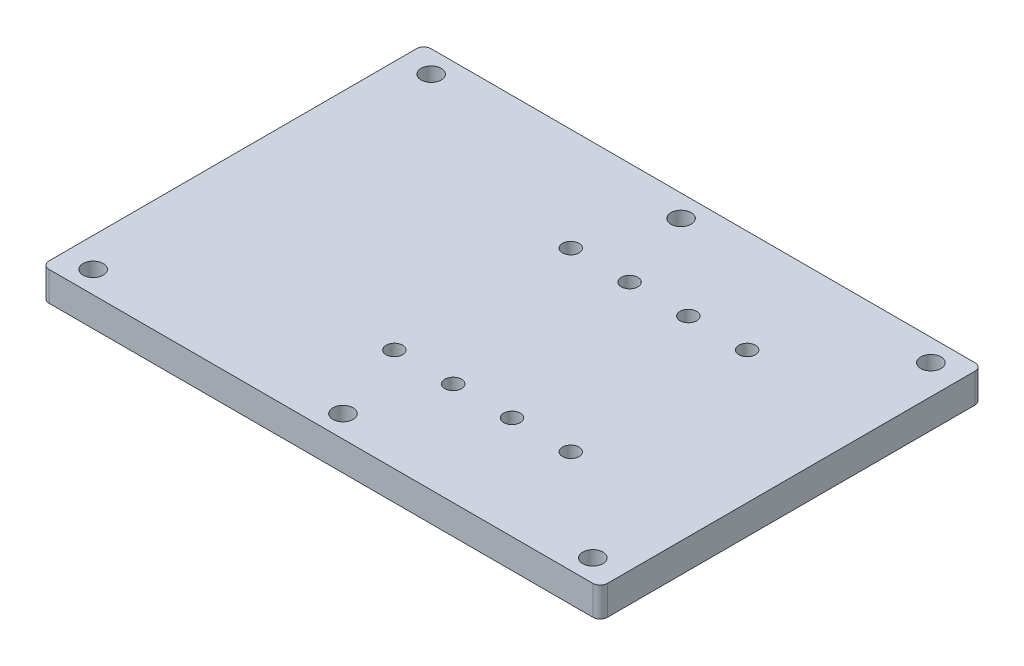
ISO-10303-21;
HEADER;
FILE_DESCRIPTION(('STEP AP214'),'2;1');
FILE_NAME('part.step','',(''),(''),'','','');
FILE_SCHEMA(('AUTOMOTIVE_DESIGN { 1 0 10303 214 1 1 1 1 }'));
ENDSEC;
DATA;
#1=APPLICATION_CONTEXT('core data for automotive mechanical design processes');
#2=APPLICATION_PROTOCOL_DEFINITION('international standard','automotive_design',2000,#1);
#3=PRODUCT_CONTEXT('',#1,'mechanical');
#4=PRODUCT('Part','Part','',(#3));
#5=PRODUCT_RELATED_PRODUCT_CATEGORY('part','',(#4));
#6=PRODUCT_DEFINITION_FORMATION('','',#4);
#7=PRODUCT_DEFINITION_CONTEXT('part definition',#1,'design');
#8=PRODUCT_DEFINITION('design','',#6,#7);
#9=PRODUCT_DEFINITION_SHAPE('','',#8);
#10=(LENGTH_UNIT() NAMED_UNIT(*) SI_UNIT(.MILLI.,.METRE.));
#11=(NAMED_UNIT(*) PLANE_ANGLE_UNIT() SI_UNIT($,.RADIAN.));
#12=(NAMED_UNIT(*) SI_UNIT($,.STERADIAN.) SOLID_ANGLE_UNIT());
#13=UNCERTAINTY_MEASURE_WITH_UNIT(LENGTH_MEASURE(1.E-05),#10,'distance_accuracy_value','');
#14=(GEOMETRIC_REPRESENTATION_CONTEXT(3) GLOBAL_UNCERTAINTY_ASSIGNED_CONTEXT((#13)) GLOBAL_UNIT_ASSIGNED_CONTEXT((#10,
#11,#12)) REPRESENTATION_CONTEXT('',''));
#15=CARTESIAN_POINT('',(0.,0.,0.));
#16=DIRECTION('',(0.,0.,1.));
#17=DIRECTION('',(1.,0.,0.));
#18=AXIS2_PLACEMENT_3D('',#15,#16,#17);
#19=CARTESIAN_POINT('',(241.3,25.4,-165.1));
#20=DIRECTION('',(-1.,0.,0.));
#21=DIRECTION('',(0.,0.,1.));
#22=AXIS2_PLACEMENT_3D('',#19,#20,#21);
#23=PLANE('',#22);
#24=DIRECTION('',(0.,0.,-1.));
#25=VECTOR('',#24,1.);
#26=CARTESIAN_POINT('',(241.3,25.4,-165.1));
#27=LINE('',#26,#25);
#28=CARTESIAN_POINT('',(241.3,25.4,158.75));
#29=VERTEX_POINT('',#28);
#30=CARTESIAN_POINT('',(241.3,25.4,-158.75));
#31=VERTEX_POINT('',#30);
#32=EDGE_CURVE('E130',#29,#31,#27,.T.);
#33=ORIENTED_EDGE('',*,*,#32,.F.);
#34=DIRECTION('',(0.,-1.,0.));
#35=VECTOR('',#34,1.);
#36=CARTESIAN_POINT('',(241.3,25.4,158.75));
#37=LINE('',#36,#35);
#38=CARTESIAN_POINT('',(241.3,0.,158.75));
#39=VERTEX_POINT('',#38);
#40=EDGE_CURVE('E156',#29,#39,#37,.T.);
#41=ORIENTED_EDGE('',*,*,#40,.T.);
#42=DIRECTION('',(0.,0.,-1.));
#43=VECTOR('',#42,1.);
#44=CARTESIAN_POINT('',(241.3,0.,-165.1));
#45=LINE('',#44,#43);
#46=CARTESIAN_POINT('',(241.3,0.,-158.75));
#47=VERTEX_POINT('',#46);
#48=EDGE_CURVE('E162',#39,#47,#45,.T.);
#49=ORIENTED_EDGE('',*,*,#48,.T.);
#50=DIRECTION('',(0.,-1.,0.));
#51=VECTOR('',#50,1.);
#52=CARTESIAN_POINT('',(241.3,25.4,-158.75));
#53=LINE('',#52,#51);
#54=EDGE_CURVE('E154',#47,#31,#53,.F.);
#55=ORIENTED_EDGE('',*,*,#54,.T.);
#56=EDGE_LOOP('',(#33,#41,#49,#55));
#57=FACE_BOUND('',#56,.T.);
#58=ADVANCED_FACE('F38',(#57),#23,.F.);
#59=CARTESIAN_POINT('',(-241.3,25.4,-165.1));
#60=DIRECTION('',(0.,0.,1.));
#61=DIRECTION('',(1.,0.,0.));
#62=AXIS2_PLACEMENT_3D('',#59,#60,#61);
#63=PLANE('',#62);
#64=DIRECTION('',(-1.,0.,0.));
#65=VECTOR('',#64,1.);
#66=CARTESIAN_POINT('',(-241.3,25.4,-165.1));
#67=LINE('',#66,#65);
#68=CARTESIAN_POINT('',(234.95,25.4,-165.1));
#69=VERTEX_POINT('',#68);
#70=CARTESIAN_POINT('',(-234.95,25.4,-165.1));
#71=VERTEX_POINT('',#70);
#72=EDGE_CURVE('E133',#69,#71,#67,.T.);
#73=ORIENTED_EDGE('',*,*,#72,.F.);
#74=DIRECTION('',(0.,-1.,0.));
#75=VECTOR('',#74,1.);
#76=CARTESIAN_POINT('',(234.95,25.4,-165.1));
#77=LINE('',#76,#75);
#78=CARTESIAN_POINT('',(234.95,0.,-165.1));
#79=VERTEX_POINT('',#78);
#80=EDGE_CURVE('E11',#69,#79,#77,.T.);
#81=ORIENTED_EDGE('',*,*,#80,.T.);
#82=DIRECTION('',(-1.,0.,0.));
#83=VECTOR('',#82,1.);
#84=CARTESIAN_POINT('',(-241.3,0.,-165.1));
#85=LINE('',#84,#83);
#86=CARTESIAN_POINT('',(-234.95,0.,-165.1));
#87=VERTEX_POINT('',#86);
#88=EDGE_CURVE('E135',#79,#87,#85,.T.);
#89=ORIENTED_EDGE('',*,*,#88,.T.);
#90=DIRECTION('',(0.,-1.,0.));
#91=VECTOR('',#90,1.);
#92=CARTESIAN_POINT('',(-234.95,25.4,-165.1));
#93=LINE('',#92,#91);
#94=EDGE_CURVE('E46',#87,#71,#93,.F.);
#95=ORIENTED_EDGE('',*,*,#94,.T.);
#96=EDGE_LOOP('',(#73,#81,#89,#95));
#97=FACE_BOUND('',#96,.T.);
#98=ADVANCED_FACE('F278',(#97),#63,.F.);
#99=CARTESIAN_POINT('',(-241.3,25.4,-165.1));
#100=DIRECTION('',(1.,0.,0.));
#101=DIRECTION('',(0.,0.,-1.));
#102=AXIS2_PLACEMENT_3D('',#99,#100,#101);
#103=PLANE('',#102);
#104=DIRECTION('',(0.,0.,1.));
#105=VECTOR('',#104,1.);
#106=CARTESIAN_POINT('',(-241.3,0.,-165.1));
#107=LINE('',#106,#105);
#108=CARTESIAN_POINT('',(-241.3,0.,-158.75));
#109=VERTEX_POINT('',#108);
#110=CARTESIAN_POINT('',(-241.3,0.,158.75));
#111=VERTEX_POINT('',#110);
#112=EDGE_CURVE('E131',#109,#111,#107,.T.);
#113=ORIENTED_EDGE('',*,*,#112,.T.);
#114=DIRECTION('',(0.,-1.,0.));
#115=VECTOR('',#114,1.);
#116=CARTESIAN_POINT('',(-241.3,25.4,158.75));
#117=LINE('',#116,#115);
#118=CARTESIAN_POINT('',(-241.3,25.4,158.75));
#119=VERTEX_POINT('',#118);
#120=EDGE_CURVE('E109',#111,#119,#117,.F.);
#121=ORIENTED_EDGE('',*,*,#120,.T.);
#122=DIRECTION('',(0.,0.,1.));
#123=VECTOR('',#122,1.);
#124=CARTESIAN_POINT('',(-241.3,25.4,-165.1));
#125=LINE('',#124,#123);
#126=CARTESIAN_POINT('',(-241.3,25.4,-158.75));
#127=VERTEX_POINT('',#126);
#128=EDGE_CURVE('E174',#127,#119,#125,.T.);
#129=ORIENTED_EDGE('',*,*,#128,.F.);
#130=DIRECTION('',(0.,-1.,0.));
#131=VECTOR('',#130,1.);
#132=CARTESIAN_POINT('',(-241.3,25.4,-158.75));
#133=LINE('',#132,#131);
#134=EDGE_CURVE('E114',#127,#109,#133,.T.);
#135=ORIENTED_EDGE('',*,*,#134,.T.);
#136=EDGE_LOOP('',(#113,#121,#129,#135));
#137=FACE_BOUND('',#136,.T.);
#138=ADVANCED_FACE('F284',(#137),#103,.F.);
#139=CARTESIAN_POINT('',(-241.3,25.4,165.1));
#140=DIRECTION('',(0.,0.,-1.));
#141=DIRECTION('',(-1.,0.,0.));
#142=AXIS2_PLACEMENT_3D('',#139,#140,#141);
#143=PLANE('',#142);
#144=DIRECTION('',(1.,0.,0.));
#145=VECTOR('',#144,1.);
#146=CARTESIAN_POINT('',(-241.3,25.4,165.1));
#147=LINE('',#146,#145);
#148=CARTESIAN_POINT('',(-234.95,25.4,165.1));
#149=VERTEX_POINT('',#148);
#150=CARTESIAN_POINT('',(234.95,25.4,165.1));
#151=VERTEX_POINT('',#150);
#152=EDGE_CURVE('E124',#149,#151,#147,.T.);
#153=ORIENTED_EDGE('',*,*,#152,.F.);
#154=DIRECTION('',(0.,-1.,0.));
#155=VECTOR('',#154,1.);
#156=CARTESIAN_POINT('',(-234.95,25.4,165.1));
#157=LINE('',#156,#155);
#158=CARTESIAN_POINT('',(-234.95,0.,165.1));
#159=VERTEX_POINT('',#158);
#160=EDGE_CURVE('E108',#149,#159,#157,.T.);
#161=ORIENTED_EDGE('',*,*,#160,.T.);
#162=DIRECTION('',(1.,0.,0.));
#163=VECTOR('',#162,1.);
#164=CARTESIAN_POINT('',(-241.3,0.,165.1));
#165=LINE('',#164,#163);
#166=CARTESIAN_POINT('',(234.95,0.,165.1));
#167=VERTEX_POINT('',#166);
#168=EDGE_CURVE('E121',#159,#167,#165,.T.);
#169=ORIENTED_EDGE('',*,*,#168,.T.);
#170=DIRECTION('',(0.,-1.,0.));
#171=VECTOR('',#170,1.);
#172=CARTESIAN_POINT('',(234.95,25.4,165.1));
#173=LINE('',#172,#171);
#174=EDGE_CURVE('E126',#167,#151,#173,.F.);
#175=ORIENTED_EDGE('',*,*,#174,.T.);
#176=EDGE_LOOP('',(#153,#161,#169,#175));
#177=FACE_BOUND('',#176,.T.);
#178=ADVANCED_FACE('F120',(#177),#143,.F.);
#179=CARTESIAN_POINT('',(0.,25.4,0.));
#180=DIRECTION('',(0.,1.,0.));
#181=DIRECTION('',(0.,0.,1.));
#182=AXIS2_PLACEMENT_3D('',#179,#180,#181);
#183=PLANE('',#182);
#184=CARTESIAN_POINT('',(25.3999999999998,25.4,-76.2));
#185=DIRECTION('',(0.,1.,0.));
#186=DIRECTION('',(0.,0.,1.));
#187=AXIS2_PLACEMENT_3D('',#184,#185,#186);
#188=CIRCLE('',#187,7.1628);
#189=CARTESIAN_POINT('',(25.3999999999998,25.4,-69.0372));
#190=VERTEX_POINT('',#189);
#191=EDGE_CURVE('E210',#190,#190,#188,.T.);
#192=ORIENTED_EDGE('',*,*,#191,.F.);
#193=EDGE_LOOP('',(#192));
#194=FACE_BOUND('',#193,.T.);
#195=CARTESIAN_POINT('',(76.1999999999998,25.4,-76.2));
#196=DIRECTION('',(0.,1.,0.));
#197=DIRECTION('',(0.,0.,1.));
#198=AXIS2_PLACEMENT_3D('',#195,#196,#197);
#199=CIRCLE('',#198,7.1628);
#200=CARTESIAN_POINT('',(76.1999999999998,25.4,-69.0372));
#201=VERTEX_POINT('',#200);
#202=EDGE_CURVE('E213',#201,#201,#199,.T.);
#203=ORIENTED_EDGE('',*,*,#202,.F.);
#204=EDGE_LOOP('',(#203));
#205=FACE_BOUND('',#204,.T.);
#206=CARTESIAN_POINT('',(127.,25.4,-76.2));
#207=DIRECTION('',(0.,1.,0.));
#208=DIRECTION('',(0.,0.,1.));
#209=AXIS2_PLACEMENT_3D('',#206,#207,#208);
#210=CIRCLE('',#209,7.1628);
#211=CARTESIAN_POINT('',(127.,25.4,-69.0372));
#212=VERTEX_POINT('',#211);
#213=EDGE_CURVE('E216',#212,#212,#210,.T.);
#214=ORIENTED_EDGE('',*,*,#213,.F.);
#215=EDGE_LOOP('',(#214));
#216=FACE_BOUND('',#215,.T.);
#217=CARTESIAN_POINT('',(127.,25.4,76.2));
#218=DIRECTION('',(0.,1.,0.));
#219=DIRECTION('',(0.,0.,1.));
#220=AXIS2_PLACEMENT_3D('',#217,#218,#219);
#221=CIRCLE('',#220,7.1628);
#222=CARTESIAN_POINT('',(127.,25.4,83.3628));
#223=VERTEX_POINT('',#222);
#224=EDGE_CURVE('E219',#223,#223,#221,.T.);
#225=ORIENTED_EDGE('',*,*,#224,.F.);
#226=EDGE_LOOP('',(#225));
#227=FACE_BOUND('',#226,.T.);
#228=CARTESIAN_POINT('',(76.1999999999998,25.4,76.2));
#229=DIRECTION('',(0.,1.,0.));
#230=DIRECTION('',(0.,0.,1.));
#231=AXIS2_PLACEMENT_3D('',#228,#229,#230);
#232=CIRCLE('',#231,7.1628);
#233=CARTESIAN_POINT('',(76.1999999999998,25.4,83.3628));
#234=VERTEX_POINT('',#233);
#235=EDGE_CURVE('E222',#234,#234,#232,.T.);
#236=ORIENTED_EDGE('',*,*,#235,.F.);
#237=EDGE_LOOP('',(#236));
#238=FACE_BOUND('',#237,.T.);
#239=CARTESIAN_POINT('',(25.3999999999998,25.4,76.2));
#240=DIRECTION('',(0.,1.,0.));
#241=DIRECTION('',(0.,0.,1.));
#242=AXIS2_PLACEMENT_3D('',#239,#240,#241);
#243=CIRCLE('',#242,7.1628);
#244=CARTESIAN_POINT('',(25.3999999999998,25.4,83.3628));
#245=VERTEX_POINT('',#244);
#246=EDGE_CURVE('E225',#245,#245,#243,.T.);
#247=ORIENTED_EDGE('',*,*,#246,.F.);
#248=EDGE_LOOP('',(#247));
#249=FACE_BOUND('',#248,.T.);
#250=CARTESIAN_POINT('',(-25.4000000000002,25.4,76.2));
#251=DIRECTION('',(0.,1.,0.));
#252=DIRECTION('',(0.,0.,1.));
#253=AXIS2_PLACEMENT_3D('',#250,#251,#252);
#254=CIRCLE('',#253,7.1628);
#255=CARTESIAN_POINT('',(-25.4000000000002,25.4,83.3628));
#256=VERTEX_POINT('',#255);
#257=EDGE_CURVE('E228',#256,#256,#254,.T.);
#258=ORIENTED_EDGE('',*,*,#257,.F.);
#259=EDGE_LOOP('',(#258));
#260=FACE_BOUND('',#259,.T.);
#261=CARTESIAN_POINT('',(-25.4000000000002,25.4,-76.2));
#262=DIRECTION('',(0.,1.,0.));
#263=DIRECTION('',(0.,0.,1.));
#264=AXIS2_PLACEMENT_3D('',#261,#262,#263);
#265=CIRCLE('',#264,7.1628);
#266=CARTESIAN_POINT('',(-25.4000000000002,25.4,-69.0372));
#267=VERTEX_POINT('',#266);
#268=EDGE_CURVE('E231',#267,#267,#265,.T.);
#269=ORIENTED_EDGE('',*,*,#268,.F.);
#270=EDGE_LOOP('',(#269));
#271=FACE_BOUND('',#270,.T.);
#272=CARTESIAN_POINT('',(0.,25.4,-146.05));
#273=DIRECTION('',(0.,1.,0.));
#274=DIRECTION('',(0.,0.,1.));
#275=AXIS2_PLACEMENT_3D('',#272,#273,#274);
#276=CIRCLE('',#275,8.7376);
#277=CARTESIAN_POINT('',(0.,25.4,-137.3124));
#278=VERTEX_POINT('',#277);
#279=EDGE_CURVE('E167',#278,#278,#276,.T.);
#280=ORIENTED_EDGE('',*,*,#279,.F.);
#281=EDGE_LOOP('',(#280));
#282=FACE_BOUND('',#281,.T.);
#283=CARTESIAN_POINT('',(-215.9,25.4,146.05));
#284=DIRECTION('',(0.,1.,0.));
#285=DIRECTION('',(0.,0.,1.));
#286=AXIS2_PLACEMENT_3D('',#283,#284,#285);
#287=CIRCLE('',#286,8.73760000000002);
#288=CARTESIAN_POINT('',(-215.9,25.4,154.7876));
#289=VERTEX_POINT('',#288);
#290=EDGE_CURVE('E170',#289,#289,#287,.T.);
#291=ORIENTED_EDGE('',*,*,#290,.F.);
#292=EDGE_LOOP('',(#291));
#293=FACE_BOUND('',#292,.T.);
#294=CARTESIAN_POINT('',(215.9,25.4,146.05));
#295=DIRECTION('',(0.,1.,0.));
#296=DIRECTION('',(0.,0.,1.));
#297=AXIS2_PLACEMENT_3D('',#294,#295,#296);
#298=CIRCLE('',#297,8.73760000000002);
#299=CARTESIAN_POINT('',(215.9,25.4,154.7876));
#300=VERTEX_POINT('',#299);
#301=EDGE_CURVE('E180',#300,#300,#298,.T.);
#302=ORIENTED_EDGE('',*,*,#301,.F.);
#303=EDGE_LOOP('',(#302));
#304=FACE_BOUND('',#303,.T.);
#305=CARTESIAN_POINT('',(-215.9,25.4,-146.05));
#306=DIRECTION('',(0.,1.,0.));
#307=DIRECTION('',(0.,0.,1.));
#308=AXIS2_PLACEMENT_3D('',#305,#306,#307);
#309=CIRCLE('',#308,8.73760000000002);
#310=CARTESIAN_POINT('',(-215.9,25.4,-137.3124));
#311=VERTEX_POINT('',#310);
#312=EDGE_CURVE('E183',#311,#311,#309,.T.);
#313=ORIENTED_EDGE('',*,*,#312,.F.);
#314=EDGE_LOOP('',(#313));
#315=FACE_BOUND('',#314,.T.);
#316=CARTESIAN_POINT('',(0.,25.4,146.05));
#317=DIRECTION('',(0.,1.,0.));
#318=DIRECTION('',(0.,0.,1.));
#319=AXIS2_PLACEMENT_3D('',#316,#317,#318);
#320=CIRCLE('',#319,8.7376);
#321=CARTESIAN_POINT('',(0.,25.4,154.7876));
#322=VERTEX_POINT('',#321);
#323=EDGE_CURVE('E186',#322,#322,#320,.T.);
#324=ORIENTED_EDGE('',*,*,#323,.F.);
#325=EDGE_LOOP('',(#324));
#326=FACE_BOUND('',#325,.T.);
#327=CARTESIAN_POINT('',(215.9,25.4,-146.05));
#328=DIRECTION('',(0.,1.,0.));
#329=DIRECTION('',(0.,0.,1.));
#330=AXIS2_PLACEMENT_3D('',#327,#328,#329);
#331=CIRCLE('',#330,8.73760000000002);
#332=CARTESIAN_POINT('',(215.9,25.4,-137.3124));
#333=VERTEX_POINT('',#332);
#334=EDGE_CURVE('E189',#333,#333,#331,.T.);
#335=ORIENTED_EDGE('',*,*,#334,.F.);
#336=EDGE_LOOP('',(#335));
#337=FACE_BOUND('',#336,.T.);
#338=ORIENTED_EDGE('',*,*,#128,.T.);
#339=CARTESIAN_POINT('',(-234.95,25.4,158.75));
#340=DIRECTION('',(0.,1.,0.));
#341=DIRECTION('',(0.,0.,1.));
#342=AXIS2_PLACEMENT_3D('',#339,#340,#341);
#343=CIRCLE('',#342,6.35);
#344=EDGE_CURVE('E152',#119,#149,#343,.T.);
#345=ORIENTED_EDGE('',*,*,#344,.T.);
#346=ORIENTED_EDGE('',*,*,#152,.T.);
#347=CARTESIAN_POINT('',(234.95,25.4,158.75));
#348=DIRECTION('',(0.,1.,0.));
#349=DIRECTION('',(0.,0.,1.));
#350=AXIS2_PLACEMENT_3D('',#347,#348,#349);
#351=CIRCLE('',#350,6.35);
#352=EDGE_CURVE('E150',#151,#29,#351,.T.);
#353=ORIENTED_EDGE('',*,*,#352,.T.);
#354=ORIENTED_EDGE('',*,*,#32,.T.);
#355=CARTESIAN_POINT('',(234.95,25.4,-158.75));
#356=DIRECTION('',(0.,1.,0.));
#357=DIRECTION('',(0.,0.,1.));
#358=AXIS2_PLACEMENT_3D('',#355,#356,#357);
#359=CIRCLE('',#358,6.35);
#360=EDGE_CURVE('E59',#31,#69,#359,.T.);
#361=ORIENTED_EDGE('',*,*,#360,.T.);
#362=ORIENTED_EDGE('',*,*,#72,.T.);
#363=CARTESIAN_POINT('',(-234.95,25.4,-158.75));
#364=DIRECTION('',(0.,1.,0.));
#365=DIRECTION('',(0.,0.,1.));
#366=AXIS2_PLACEMENT_3D('',#363,#364,#365);
#367=CIRCLE('',#366,6.35);
#368=EDGE_CURVE('E147',#71,#127,#367,.T.);
#369=ORIENTED_EDGE('',*,*,#368,.T.);
#370=EDGE_LOOP('',(#338,#345,#346,#353,#354,#361,#362,#369));
#371=FACE_BOUND('',#370,.T.);
#372=ADVANCED_FACE('F305',(#194,#205,#216,#227,#238,#249,#260,#271,#282,#293,#304,#315,#326,
#337,#371),#183,.T.);
#373=CARTESIAN_POINT('',(0.,0.,0.));
#374=DIRECTION('',(0.,1.,0.));
#375=DIRECTION('',(0.,0.,1.));
#376=AXIS2_PLACEMENT_3D('',#373,#374,#375);
#377=PLANE('',#376);
#378=CARTESIAN_POINT('',(25.3999999999998,0.,-76.2));
#379=DIRECTION('',(0.,1.,0.));
#380=DIRECTION('',(0.,0.,1.));
#381=AXIS2_PLACEMENT_3D('',#378,#379,#380);
#382=CIRCLE('',#381,7.1628);
#383=CARTESIAN_POINT('',(25.3999999999998,0.,-69.0372));
#384=VERTEX_POINT('',#383);
#385=EDGE_CURVE('E237',#384,#384,#382,.T.);
#386=ORIENTED_EDGE('',*,*,#385,.T.);
#387=EDGE_LOOP('',(#386));
#388=FACE_BOUND('',#387,.T.);
#389=CARTESIAN_POINT('',(76.1999999999998,0.,-76.2));
#390=DIRECTION('',(0.,1.,0.));
#391=DIRECTION('',(0.,0.,1.));
#392=AXIS2_PLACEMENT_3D('',#389,#390,#391);
#393=CIRCLE('',#392,7.1628);
#394=CARTESIAN_POINT('',(76.1999999999998,0.,-69.0372));
#395=VERTEX_POINT('',#394);
#396=EDGE_CURVE('E245',#395,#395,#393,.T.);
#397=ORIENTED_EDGE('',*,*,#396,.T.);
#398=EDGE_LOOP('',(#397));
#399=FACE_BOUND('',#398,.T.);
#400=CARTESIAN_POINT('',(127.,0.,-76.2));
#401=DIRECTION('',(0.,1.,0.));
#402=DIRECTION('',(0.,0.,1.));
#403=AXIS2_PLACEMENT_3D('',#400,#401,#402);
#404=CIRCLE('',#403,7.1628);
#405=CARTESIAN_POINT('',(127.,0.,-69.0372));
#406=VERTEX_POINT('',#405);
#407=EDGE_CURVE('E241',#406,#406,#404,.T.);
#408=ORIENTED_EDGE('',*,*,#407,.T.);
#409=EDGE_LOOP('',(#408));
#410=FACE_BOUND('',#409,.T.);
#411=CARTESIAN_POINT('',(127.,0.,76.2));
#412=DIRECTION('',(0.,1.,0.));
#413=DIRECTION('',(0.,0.,-1.));
#414=AXIS2_PLACEMENT_3D('',#411,#412,#413);
#415=CIRCLE('',#414,7.1628);
#416=CARTESIAN_POINT('',(127.,0.,69.0372));
#417=VERTEX_POINT('',#416);
#418=EDGE_CURVE('E238',#417,#417,#415,.T.);
#419=ORIENTED_EDGE('',*,*,#418,.T.);
#420=EDGE_LOOP('',(#419));
#421=FACE_BOUND('',#420,.T.);
#422=CARTESIAN_POINT('',(76.1999999999998,0.,76.2));
#423=DIRECTION('',(0.,1.,0.));
#424=DIRECTION('',(0.,0.,-1.));
#425=AXIS2_PLACEMENT_3D('',#422,#423,#424);
#426=CIRCLE('',#425,7.1628);
#427=CARTESIAN_POINT('',(76.1999999999998,0.,69.0372));
#428=VERTEX_POINT('',#427);
#429=EDGE_CURVE('E242',#428,#428,#426,.T.);
#430=ORIENTED_EDGE('',*,*,#429,.T.);
#431=EDGE_LOOP('',(#430));
#432=FACE_BOUND('',#431,.T.);
#433=CARTESIAN_POINT('',(25.3999999999998,0.,76.2));
#434=DIRECTION('',(0.,1.,0.));
#435=DIRECTION('',(0.,0.,-1.));
#436=AXIS2_PLACEMENT_3D('',#433,#434,#435);
#437=CIRCLE('',#436,7.1628);
#438=CARTESIAN_POINT('',(25.3999999999998,0.,69.0372));
#439=VERTEX_POINT('',#438);
#440=EDGE_CURVE('E253',#439,#439,#437,.T.);
#441=ORIENTED_EDGE('',*,*,#440,.T.);
#442=EDGE_LOOP('',(#441));
#443=FACE_BOUND('',#442,.T.);
#444=CARTESIAN_POINT('',(-25.4000000000002,0.,76.2));
#445=DIRECTION('',(0.,1.,0.));
#446=DIRECTION('',(0.,0.,-1.));
#447=AXIS2_PLACEMENT_3D('',#444,#445,#446);
#448=CIRCLE('',#447,7.1628);
#449=CARTESIAN_POINT('',(-25.4000000000002,0.,69.0372));
#450=VERTEX_POINT('',#449);
#451=EDGE_CURVE('E250',#450,#450,#448,.T.);
#452=ORIENTED_EDGE('',*,*,#451,.T.);
#453=EDGE_LOOP('',(#452));
#454=FACE_BOUND('',#453,.T.);
#455=CARTESIAN_POINT('',(-25.4000000000002,0.,-76.2));
#456=DIRECTION('',(0.,1.,0.));
#457=DIRECTION('',(0.,0.,1.));
#458=AXIS2_PLACEMENT_3D('',#455,#456,#457);
#459=CIRCLE('',#458,7.1628);
#460=CARTESIAN_POINT('',(-25.4000000000002,0.,-69.0372));
#461=VERTEX_POINT('',#460);
#462=EDGE_CURVE('E234',#461,#461,#459,.T.);
#463=ORIENTED_EDGE('',*,*,#462,.T.);
#464=EDGE_LOOP('',(#463));
#465=FACE_BOUND('',#464,.T.);
#466=CARTESIAN_POINT('',(0.,0.,-146.05));
#467=DIRECTION('',(0.,1.,0.));
#468=DIRECTION('',(0.,0.,1.));
#469=AXIS2_PLACEMENT_3D('',#466,#467,#468);
#470=CIRCLE('',#469,8.7376);
#471=CARTESIAN_POINT('',(0.,0.,-137.3124));
#472=VERTEX_POINT('',#471);
#473=EDGE_CURVE('E202',#472,#472,#470,.T.);
#474=ORIENTED_EDGE('',*,*,#473,.T.);
#475=EDGE_LOOP('',(#474));
#476=FACE_BOUND('',#475,.T.);
#477=CARTESIAN_POINT('',(-215.9,0.,146.05));
#478=DIRECTION('',(0.,1.,0.));
#479=DIRECTION('',(0.,0.,1.));
#480=AXIS2_PLACEMENT_3D('',#477,#478,#479);
#481=CIRCLE('',#480,8.73760000000002);
#482=CARTESIAN_POINT('',(-215.9,0.,154.7876));
#483=VERTEX_POINT('',#482);
#484=EDGE_CURVE('E199',#483,#483,#481,.T.);
#485=ORIENTED_EDGE('',*,*,#484,.T.);
#486=EDGE_LOOP('',(#485));
#487=FACE_BOUND('',#486,.T.);
#488=CARTESIAN_POINT('',(215.9,0.,146.05));
#489=DIRECTION('',(0.,1.,0.));
#490=DIRECTION('',(0.,0.,1.));
#491=AXIS2_PLACEMENT_3D('',#488,#489,#490);
#492=CIRCLE('',#491,8.73760000000002);
#493=CARTESIAN_POINT('',(215.9,0.,154.7876));
#494=VERTEX_POINT('',#493);
#495=EDGE_CURVE('E196',#494,#494,#492,.T.);
#496=ORIENTED_EDGE('',*,*,#495,.T.);
#497=EDGE_LOOP('',(#496));
#498=FACE_BOUND('',#497,.T.);
#499=CARTESIAN_POINT('',(-215.9,0.,-146.05));
#500=DIRECTION('',(0.,1.,0.));
#501=DIRECTION('',(0.,0.,1.));
#502=AXIS2_PLACEMENT_3D('',#499,#500,#501);
#503=CIRCLE('',#502,8.73760000000002);
#504=CARTESIAN_POINT('',(-215.9,0.,-137.3124));
#505=VERTEX_POINT('',#504);
#506=EDGE_CURVE('E195',#505,#505,#503,.T.);
#507=ORIENTED_EDGE('',*,*,#506,.T.);
#508=EDGE_LOOP('',(#507));
#509=FACE_BOUND('',#508,.T.);
#510=CARTESIAN_POINT('',(0.,0.,146.05));
#511=DIRECTION('',(0.,1.,0.));
#512=DIRECTION('',(0.,0.,1.));
#513=AXIS2_PLACEMENT_3D('',#510,#511,#512);
#514=CIRCLE('',#513,8.7376);
#515=CARTESIAN_POINT('',(0.,0.,154.7876));
#516=VERTEX_POINT('',#515);
#517=EDGE_CURVE('E205',#516,#516,#514,.T.);
#518=ORIENTED_EDGE('',*,*,#517,.T.);
#519=EDGE_LOOP('',(#518));
#520=FACE_BOUND('',#519,.T.);
#521=CARTESIAN_POINT('',(215.9,0.,-146.05));
#522=DIRECTION('',(0.,1.,0.));
#523=DIRECTION('',(0.,0.,1.));
#524=AXIS2_PLACEMENT_3D('',#521,#522,#523);
#525=CIRCLE('',#524,8.73760000000002);
#526=CARTESIAN_POINT('',(215.9,0.,-137.3124));
#527=VERTEX_POINT('',#526);
#528=EDGE_CURVE('E192',#527,#527,#525,.T.);
#529=ORIENTED_EDGE('',*,*,#528,.T.);
#530=EDGE_LOOP('',(#529));
#531=FACE_BOUND('',#530,.T.);
#532=ORIENTED_EDGE('',*,*,#168,.F.);
#533=CARTESIAN_POINT('',(-234.95,0.,158.75));
#534=DIRECTION('',(0.,1.,0.));
#535=DIRECTION('',(0.,0.,1.));
#536=AXIS2_PLACEMENT_3D('',#533,#534,#535);
#537=CIRCLE('',#536,6.35);
#538=EDGE_CURVE('E104',#159,#111,#537,.F.);
#539=ORIENTED_EDGE('',*,*,#538,.T.);
#540=ORIENTED_EDGE('',*,*,#112,.F.);
#541=CARTESIAN_POINT('',(-234.95,0.,-158.75));
#542=DIRECTION('',(0.,1.,0.));
#543=DIRECTION('',(0.,0.,1.));
#544=AXIS2_PLACEMENT_3D('',#541,#542,#543);
#545=CIRCLE('',#544,6.35);
#546=EDGE_CURVE('E125',#109,#87,#545,.F.);
#547=ORIENTED_EDGE('',*,*,#546,.T.);
#548=ORIENTED_EDGE('',*,*,#88,.F.);
#549=CARTESIAN_POINT('',(234.95,0.,-158.75));
#550=DIRECTION('',(0.,1.,0.));
#551=DIRECTION('',(0.,0.,1.));
#552=AXIS2_PLACEMENT_3D('',#549,#550,#551);
#553=CIRCLE('',#552,6.35);
#554=EDGE_CURVE('E141',#79,#47,#553,.F.);
#555=ORIENTED_EDGE('',*,*,#554,.T.);
#556=ORIENTED_EDGE('',*,*,#48,.F.);
#557=CARTESIAN_POINT('',(234.95,0.,158.75));
#558=DIRECTION('',(0.,1.,0.));
#559=DIRECTION('',(0.,0.,1.));
#560=AXIS2_PLACEMENT_3D('',#557,#558,#559);
#561=CIRCLE('',#560,6.35);
#562=EDGE_CURVE('E115',#39,#167,#561,.F.);
#563=ORIENTED_EDGE('',*,*,#562,.T.);
#564=EDGE_LOOP('',(#532,#539,#540,#547,#548,#555,#556,#563));
#565=FACE_BOUND('',#564,.T.);
#566=ADVANCED_FACE('F128',(#388,#399,#410,#421,#432,#443,#454,#465,#476,#487,#498,#509,#520,
#531,#565),#377,.F.);
#567=CARTESIAN_POINT('',(215.9,0.,-146.05));
#568=DIRECTION('',(0.,1.,0.));
#569=DIRECTION('',(0.,0.,1.));
#570=AXIS2_PLACEMENT_3D('',#567,#568,#569);
#571=CYLINDRICAL_SURFACE('',#570,8.73760000000002);
#572=ORIENTED_EDGE('',*,*,#334,.T.);
#573=EDGE_LOOP('',(#572));
#574=FACE_BOUND('',#573,.T.);
#575=ORIENTED_EDGE('',*,*,#528,.F.);
#576=EDGE_LOOP('',(#575));
#577=FACE_BOUND('',#576,.T.);
#578=ADVANCED_FACE('F313',(#574,#577),#571,.F.);
#579=CARTESIAN_POINT('',(0.,0.,146.05));
#580=DIRECTION('',(0.,1.,0.));
#581=DIRECTION('',(0.,0.,1.));
#582=AXIS2_PLACEMENT_3D('',#579,#580,#581);
#583=CYLINDRICAL_SURFACE('',#582,8.7376);
#584=ORIENTED_EDGE('',*,*,#323,.T.);
#585=EDGE_LOOP('',(#584));
#586=FACE_BOUND('',#585,.T.);
#587=ORIENTED_EDGE('',*,*,#517,.F.);
#588=EDGE_LOOP('',(#587));
#589=FACE_BOUND('',#588,.T.);
#590=ADVANCED_FACE('F351',(#586,#589),#583,.F.);
#591=CARTESIAN_POINT('',(-215.9,0.,-146.05));
#592=DIRECTION('',(0.,1.,0.));
#593=DIRECTION('',(0.,0.,1.));
#594=AXIS2_PLACEMENT_3D('',#591,#592,#593);
#595=CYLINDRICAL_SURFACE('',#594,8.73760000000002);
#596=ORIENTED_EDGE('',*,*,#312,.T.);
#597=EDGE_LOOP('',(#596));
#598=FACE_BOUND('',#597,.T.);
#599=ORIENTED_EDGE('',*,*,#506,.F.);
#600=EDGE_LOOP('',(#599));
#601=FACE_BOUND('',#600,.T.);
#602=ADVANCED_FACE('F360',(#598,#601),#595,.F.);
#603=CARTESIAN_POINT('',(215.9,0.,146.05));
#604=DIRECTION('',(0.,1.,0.));
#605=DIRECTION('',(0.,0.,1.));
#606=AXIS2_PLACEMENT_3D('',#603,#604,#605);
#607=CYLINDRICAL_SURFACE('',#606,8.73760000000002);
#608=ORIENTED_EDGE('',*,*,#301,.T.);
#609=EDGE_LOOP('',(#608));
#610=FACE_BOUND('',#609,.T.);
#611=ORIENTED_EDGE('',*,*,#495,.F.);
#612=EDGE_LOOP('',(#611));
#613=FACE_BOUND('',#612,.T.);
#614=ADVANCED_FACE('F370',(#610,#613),#607,.F.);
#615=CARTESIAN_POINT('',(-215.9,0.,146.05));
#616=DIRECTION('',(0.,1.,0.));
#617=DIRECTION('',(0.,0.,1.));
#618=AXIS2_PLACEMENT_3D('',#615,#616,#617);
#619=CYLINDRICAL_SURFACE('',#618,8.73760000000002);
#620=ORIENTED_EDGE('',*,*,#290,.T.);
#621=EDGE_LOOP('',(#620));
#622=FACE_BOUND('',#621,.T.);
#623=ORIENTED_EDGE('',*,*,#484,.F.);
#624=EDGE_LOOP('',(#623));
#625=FACE_BOUND('',#624,.T.);
#626=ADVANCED_FACE('F380',(#622,#625),#619,.F.);
#627=CARTESIAN_POINT('',(0.,0.,-146.05));
#628=DIRECTION('',(0.,1.,0.));
#629=DIRECTION('',(0.,0.,1.));
#630=AXIS2_PLACEMENT_3D('',#627,#628,#629);
#631=CYLINDRICAL_SURFACE('',#630,8.7376);
#632=ORIENTED_EDGE('',*,*,#279,.T.);
#633=EDGE_LOOP('',(#632));
#634=FACE_BOUND('',#633,.T.);
#635=ORIENTED_EDGE('',*,*,#473,.F.);
#636=EDGE_LOOP('',(#635));
#637=FACE_BOUND('',#636,.T.);
#638=ADVANCED_FACE('F389',(#634,#637),#631,.F.);
#639=CARTESIAN_POINT('',(-25.4000000000002,0.,-76.2));
#640=DIRECTION('',(0.,1.,0.));
#641=DIRECTION('',(0.,0.,1.));
#642=AXIS2_PLACEMENT_3D('',#639,#640,#641);
#643=CYLINDRICAL_SURFACE('',#642,7.1628);
#644=ORIENTED_EDGE('',*,*,#268,.T.);
#645=EDGE_LOOP('',(#644));
#646=FACE_BOUND('',#645,.T.);
#647=ORIENTED_EDGE('',*,*,#462,.F.);
#648=EDGE_LOOP('',(#647));
#649=FACE_BOUND('',#648,.T.);
#650=ADVANCED_FACE('F399',(#646,#649),#643,.F.);
#651=CARTESIAN_POINT('',(-25.4000000000002,0.,76.2));
#652=DIRECTION('',(0.,1.,0.));
#653=DIRECTION('',(0.,0.,1.));
#654=AXIS2_PLACEMENT_3D('',#651,#652,#653);
#655=CYLINDRICAL_SURFACE('',#654,7.1628);
#656=ORIENTED_EDGE('',*,*,#257,.T.);
#657=EDGE_LOOP('',(#656));
#658=FACE_BOUND('',#657,.T.);
#659=ORIENTED_EDGE('',*,*,#451,.F.);
#660=EDGE_LOOP('',(#659));
#661=FACE_BOUND('',#660,.T.);
#662=ADVANCED_FACE('F274',(#658,#661),#655,.F.);
#663=CARTESIAN_POINT('',(25.3999999999998,0.,76.2));
#664=DIRECTION('',(0.,1.,0.));
#665=DIRECTION('',(0.,0.,1.));
#666=AXIS2_PLACEMENT_3D('',#663,#664,#665);
#667=CYLINDRICAL_SURFACE('',#666,7.1628);
#668=ORIENTED_EDGE('',*,*,#246,.T.);
#669=EDGE_LOOP('',(#668));
#670=FACE_BOUND('',#669,.T.);
#671=ORIENTED_EDGE('',*,*,#440,.F.);
#672=EDGE_LOOP('',(#671));
#673=FACE_BOUND('',#672,.T.);
#674=ADVANCED_FACE('F264',(#670,#673),#667,.F.);
#675=CARTESIAN_POINT('',(76.1999999999998,0.,76.2));
#676=DIRECTION('',(0.,1.,0.));
#677=DIRECTION('',(0.,0.,1.));
#678=AXIS2_PLACEMENT_3D('',#675,#676,#677);
#679=CYLINDRICAL_SURFACE('',#678,7.1628);
#680=ORIENTED_EDGE('',*,*,#235,.T.);
#681=EDGE_LOOP('',(#680));
#682=FACE_BOUND('',#681,.T.);
#683=ORIENTED_EDGE('',*,*,#429,.F.);
#684=EDGE_LOOP('',(#683));
#685=FACE_BOUND('',#684,.T.);
#686=ADVANCED_FACE('F261',(#682,#685),#679,.F.);
#687=CARTESIAN_POINT('',(127.,0.,76.2));
#688=DIRECTION('',(0.,1.,0.));
#689=DIRECTION('',(0.,0.,1.));
#690=AXIS2_PLACEMENT_3D('',#687,#688,#689);
#691=CYLINDRICAL_SURFACE('',#690,7.1628);
#692=ORIENTED_EDGE('',*,*,#224,.T.);
#693=EDGE_LOOP('',(#692));
#694=FACE_BOUND('',#693,.T.);
#695=ORIENTED_EDGE('',*,*,#418,.F.);
#696=EDGE_LOOP('',(#695));
#697=FACE_BOUND('',#696,.T.);
#698=ADVANCED_FACE('F263',(#694,#697),#691,.F.);
#699=CARTESIAN_POINT('',(127.,0.,-76.2));
#700=DIRECTION('',(0.,1.,0.));
#701=DIRECTION('',(0.,0.,1.));
#702=AXIS2_PLACEMENT_3D('',#699,#700,#701);
#703=CYLINDRICAL_SURFACE('',#702,7.1628);
#704=ORIENTED_EDGE('',*,*,#213,.T.);
#705=EDGE_LOOP('',(#704));
#706=FACE_BOUND('',#705,.T.);
#707=ORIENTED_EDGE('',*,*,#407,.F.);
#708=EDGE_LOOP('',(#707));
#709=FACE_BOUND('',#708,.T.);
#710=ADVANCED_FACE('F271',(#706,#709),#703,.F.);
#711=CARTESIAN_POINT('',(76.1999999999998,0.,-76.2));
#712=DIRECTION('',(0.,1.,0.));
#713=DIRECTION('',(0.,0.,1.));
#714=AXIS2_PLACEMENT_3D('',#711,#712,#713);
#715=CYLINDRICAL_SURFACE('',#714,7.1628);
#716=ORIENTED_EDGE('',*,*,#202,.T.);
#717=EDGE_LOOP('',(#716));
#718=FACE_BOUND('',#717,.T.);
#719=ORIENTED_EDGE('',*,*,#396,.F.);
#720=EDGE_LOOP('',(#719));
#721=FACE_BOUND('',#720,.T.);
#722=ADVANCED_FACE('F443',(#718,#721),#715,.F.);
#723=CARTESIAN_POINT('',(25.3999999999998,0.,-76.2));
#724=DIRECTION('',(0.,1.,0.));
#725=DIRECTION('',(0.,0.,1.));
#726=AXIS2_PLACEMENT_3D('',#723,#724,#725);
#727=CYLINDRICAL_SURFACE('',#726,7.1628);
#728=ORIENTED_EDGE('',*,*,#191,.T.);
#729=EDGE_LOOP('',(#728));
#730=FACE_BOUND('',#729,.T.);
#731=ORIENTED_EDGE('',*,*,#385,.F.);
#732=EDGE_LOOP('',(#731));
#733=FACE_BOUND('',#732,.T.);
#734=ADVANCED_FACE('F291',(#730,#733),#727,.F.);
#735=CARTESIAN_POINT('',(-234.95,25.4,158.75));
#736=DIRECTION('',(0.,-1.,0.));
#737=DIRECTION('',(0.,0.,-1.));
#738=AXIS2_PLACEMENT_3D('',#735,#736,#737);
#739=CYLINDRICAL_SURFACE('',#738,6.35);
#740=ORIENTED_EDGE('',*,*,#344,.F.);
#741=ORIENTED_EDGE('',*,*,#120,.F.);
#742=ORIENTED_EDGE('',*,*,#538,.F.);
#743=ORIENTED_EDGE('',*,*,#160,.F.);
#744=EDGE_LOOP('',(#740,#741,#742,#743));
#745=FACE_BOUND('',#744,.T.);
#746=ADVANCED_FACE('F107',(#745),#739,.T.);
#747=CARTESIAN_POINT('',(234.95,25.4,158.75));
#748=DIRECTION('',(0.,-1.,0.));
#749=DIRECTION('',(0.,0.,-1.));
#750=AXIS2_PLACEMENT_3D('',#747,#748,#749);
#751=CYLINDRICAL_SURFACE('',#750,6.35);
#752=ORIENTED_EDGE('',*,*,#352,.F.);
#753=ORIENTED_EDGE('',*,*,#174,.F.);
#754=ORIENTED_EDGE('',*,*,#562,.F.);
#755=ORIENTED_EDGE('',*,*,#40,.F.);
#756=EDGE_LOOP('',(#752,#753,#754,#755));
#757=FACE_BOUND('',#756,.T.);
#758=ADVANCED_FACE('F290',(#757),#751,.T.);
#759=CARTESIAN_POINT('',(234.95,25.4,-158.75));
#760=DIRECTION('',(0.,-1.,0.));
#761=DIRECTION('',(0.,0.,-1.));
#762=AXIS2_PLACEMENT_3D('',#759,#760,#761);
#763=CYLINDRICAL_SURFACE('',#762,6.35);
#764=ORIENTED_EDGE('',*,*,#360,.F.);
#765=ORIENTED_EDGE('',*,*,#54,.F.);
#766=ORIENTED_EDGE('',*,*,#554,.F.);
#767=ORIENTED_EDGE('',*,*,#80,.F.);
#768=EDGE_LOOP('',(#764,#765,#766,#767));
#769=FACE_BOUND('',#768,.T.);
#770=ADVANCED_FACE('F293',(#769),#763,.T.);
#771=CARTESIAN_POINT('',(-234.95,25.4,-158.75));
#772=DIRECTION('',(0.,-1.,0.));
#773=DIRECTION('',(0.,0.,-1.));
#774=AXIS2_PLACEMENT_3D('',#771,#772,#773);
#775=CYLINDRICAL_SURFACE('',#774,6.35);
#776=ORIENTED_EDGE('',*,*,#368,.F.);
#777=ORIENTED_EDGE('',*,*,#94,.F.);
#778=ORIENTED_EDGE('',*,*,#546,.F.);
#779=ORIENTED_EDGE('',*,*,#134,.F.);
#780=EDGE_LOOP('',(#776,#777,#778,#779));
#781=FACE_BOUND('',#780,.T.);
#782=ADVANCED_FACE('F40',(#781),#775,.T.);
#783=CLOSED_SHELL('',(#58,#98,#138,#178,#372,#566,#578,#590,#602,#614,#626,#638,#650,#662,#674,
#686,#698,#710,#722,#734,#746,#758,#770,#782));
#784=MANIFOLD_SOLID_BREP('B2',#783);
#785=ADVANCED_BREP_SHAPE_REPRESENTATION('',(#18,#784),#14);
#786=SHAPE_DEFINITION_REPRESENTATION(#9,#785);
ENDSEC;
END-ISO-10303-21;
